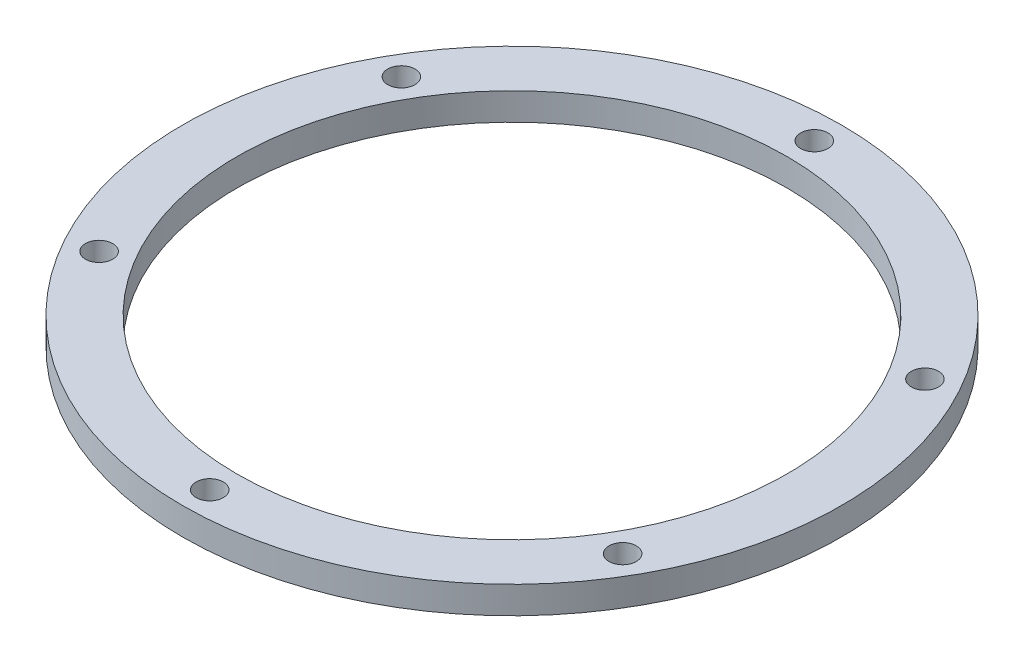
ISO-10303-21;
HEADER;
FILE_DESCRIPTION(('STEP AP214'),'2;1');
FILE_NAME('part.step','',(''),(''),'','','');
FILE_SCHEMA(('AUTOMOTIVE_DESIGN { 1 0 10303 214 1 1 1 1 }'));
ENDSEC;
DATA;
#1=APPLICATION_CONTEXT('core data for automotive mechanical design processes');
#2=APPLICATION_PROTOCOL_DEFINITION('international standard','automotive_design',2000,#1);
#3=PRODUCT_CONTEXT('',#1,'mechanical');
#4=PRODUCT('Part','Part','',(#3));
#5=PRODUCT_RELATED_PRODUCT_CATEGORY('part','',(#4));
#6=PRODUCT_DEFINITION_FORMATION('','',#4);
#7=PRODUCT_DEFINITION_CONTEXT('part definition',#1,'design');
#8=PRODUCT_DEFINITION('design','',#6,#7);
#9=PRODUCT_DEFINITION_SHAPE('','',#8);
#10=(LENGTH_UNIT() NAMED_UNIT(*) SI_UNIT(.MILLI.,.METRE.));
#11=(NAMED_UNIT(*) PLANE_ANGLE_UNIT() SI_UNIT($,.RADIAN.));
#12=(NAMED_UNIT(*) SI_UNIT($,.STERADIAN.) SOLID_ANGLE_UNIT());
#13=UNCERTAINTY_MEASURE_WITH_UNIT(LENGTH_MEASURE(1.E-05),#10,'distance_accuracy_value','');
#14=(GEOMETRIC_REPRESENTATION_CONTEXT(3) GLOBAL_UNCERTAINTY_ASSIGNED_CONTEXT((#13)) GLOBAL_UNIT_ASSIGNED_CONTEXT((#10,
#11,#12)) REPRESENTATION_CONTEXT('',''));
#15=CARTESIAN_POINT('',(0.,0.,0.));
#16=DIRECTION('',(0.,0.,1.));
#17=DIRECTION('',(1.,0.,0.));
#18=AXIS2_PLACEMENT_3D('',#15,#16,#17);
#19=CARTESIAN_POINT('',(0.,3.,0.));
#20=DIRECTION('',(0.,1.,0.));
#21=DIRECTION('',(0.,0.,1.));
#22=AXIS2_PLACEMENT_3D('',#19,#20,#21);
#23=PLANE('',#22);
#24=CARTESIAN_POINT('',(-28.7953446758324,3.,-16.6250000000003));
#25=DIRECTION('',(0.,1.,0.));
#26=DIRECTION('',(0.,0.,1.));
#27=AXIS2_PLACEMENT_3D('',#24,#25,#26);
#28=CIRCLE('',#27,1.5);
#29=CARTESIAN_POINT('',(-28.7953446758324,3.,-15.1250000000003));
#30=VERTEX_POINT('',#29);
#31=EDGE_CURVE('E69',#30,#30,#28,.T.);
#32=ORIENTED_EDGE('',*,*,#31,.F.);
#33=EDGE_LOOP('',(#32));
#34=FACE_BOUND('',#33,.T.);
#35=CARTESIAN_POINT('',(-28.7953446758327,3.,16.6249999999997));
#36=DIRECTION('',(0.,1.,0.));
#37=DIRECTION('',(0.,0.,1.));
#38=AXIS2_PLACEMENT_3D('',#35,#36,#37);
#39=CIRCLE('',#38,1.5);
#40=CARTESIAN_POINT('',(-28.7953446758327,3.,18.1249999999997));
#41=VERTEX_POINT('',#40);
#42=EDGE_CURVE('E73',#41,#41,#39,.T.);
#43=ORIENTED_EDGE('',*,*,#42,.F.);
#44=EDGE_LOOP('',(#43));
#45=FACE_BOUND('',#44,.T.);
#46=CARTESIAN_POINT('',(0.,3.,33.25));
#47=DIRECTION('',(0.,1.,0.));
#48=DIRECTION('',(0.,0.,1.));
#49=AXIS2_PLACEMENT_3D('',#46,#47,#48);
#50=CIRCLE('',#49,1.5);
#51=CARTESIAN_POINT('',(0.,3.,34.75));
#52=VERTEX_POINT('',#51);
#53=EDGE_CURVE('E77',#52,#52,#50,.T.);
#54=ORIENTED_EDGE('',*,*,#53,.F.);
#55=EDGE_LOOP('',(#54));
#56=FACE_BOUND('',#55,.T.);
#57=CARTESIAN_POINT('',(28.7953446758325,3.,16.6250000000001));
#58=DIRECTION('',(0.,1.,0.));
#59=DIRECTION('',(0.,0.,1.));
#60=AXIS2_PLACEMENT_3D('',#57,#58,#59);
#61=CIRCLE('',#60,1.5);
#62=CARTESIAN_POINT('',(28.7953446758325,3.,18.1250000000001));
#63=VERTEX_POINT('',#62);
#64=EDGE_CURVE('E81',#63,#63,#61,.T.);
#65=ORIENTED_EDGE('',*,*,#64,.F.);
#66=EDGE_LOOP('',(#65));
#67=FACE_BOUND('',#66,.T.);
#68=CARTESIAN_POINT('',(28.7953446758326,3.,-16.6249999999999));
#69=DIRECTION('',(0.,1.,0.));
#70=DIRECTION('',(0.,0.,1.));
#71=AXIS2_PLACEMENT_3D('',#68,#69,#70);
#72=CIRCLE('',#71,1.5);
#73=CARTESIAN_POINT('',(28.7953446758326,3.,-15.1249999999999));
#74=VERTEX_POINT('',#73);
#75=EDGE_CURVE('E85',#74,#74,#72,.T.);
#76=ORIENTED_EDGE('',*,*,#75,.F.);
#77=EDGE_LOOP('',(#76));
#78=FACE_BOUND('',#77,.T.);
#79=CARTESIAN_POINT('',(0.,3.,-33.25));
#80=DIRECTION('',(0.,1.,0.));
#81=DIRECTION('',(0.,0.,1.));
#82=AXIS2_PLACEMENT_3D('',#79,#80,#81);
#83=CIRCLE('',#82,1.5);
#84=CARTESIAN_POINT('',(0.,3.,-31.75));
#85=VERTEX_POINT('',#84);
#86=EDGE_CURVE('E58',#85,#85,#83,.T.);
#87=ORIENTED_EDGE('',*,*,#86,.F.);
#88=EDGE_LOOP('',(#87));
#89=FACE_BOUND('',#88,.T.);
#90=CARTESIAN_POINT('',(0.,3.,0.));
#91=DIRECTION('',(0.,1.,0.));
#92=DIRECTION('',(0.,0.,1.));
#93=AXIS2_PLACEMENT_3D('',#90,#91,#92);
#94=CIRCLE('',#93,36.25);
#95=CARTESIAN_POINT('',(0.,3.,36.25));
#96=VERTEX_POINT('',#95);
#97=EDGE_CURVE('E10',#96,#96,#94,.T.);
#98=ORIENTED_EDGE('',*,*,#97,.T.);
#99=EDGE_LOOP('',(#98));
#100=FACE_BOUND('',#99,.T.);
#101=CARTESIAN_POINT('',(0.,3.,0.));
#102=DIRECTION('',(0.,1.,0.));
#103=DIRECTION('',(0.,0.,1.));
#104=AXIS2_PLACEMENT_3D('',#101,#102,#103);
#105=CIRCLE('',#104,30.25);
#106=CARTESIAN_POINT('',(0.,3.,30.25));
#107=VERTEX_POINT('',#106);
#108=EDGE_CURVE('E52',#107,#107,#105,.T.);
#109=ORIENTED_EDGE('',*,*,#108,.F.);
#110=EDGE_LOOP('',(#109));
#111=FACE_BOUND('',#110,.T.);
#112=ADVANCED_FACE('F39',(#34,#45,#56,#67,#78,#89,#100,#111),#23,.T.);
#113=CARTESIAN_POINT('',(0.,0.,0.));
#114=DIRECTION('',(0.,1.,0.));
#115=DIRECTION('',(0.,0.,1.));
#116=AXIS2_PLACEMENT_3D('',#113,#114,#115);
#117=PLANE('',#116);
#118=CARTESIAN_POINT('',(-28.7953446758324,0.,-16.6250000000003));
#119=DIRECTION('',(0.,1.,0.));
#120=DIRECTION('',(0.866025403784433,0.,0.50000000000001));
#121=AXIS2_PLACEMENT_3D('',#118,#119,#120);
#122=CIRCLE('',#121,1.5);
#123=CARTESIAN_POINT('',(-27.4963065701557,0.,-15.8750000000003));
#124=VERTEX_POINT('',#123);
#125=EDGE_CURVE('E94',#124,#124,#122,.T.);
#126=ORIENTED_EDGE('',*,*,#125,.T.);
#127=EDGE_LOOP('',(#126));
#128=FACE_BOUND('',#127,.T.);
#129=CARTESIAN_POINT('',(-28.7953446758327,0.,16.6249999999997));
#130=DIRECTION('',(0.,1.,0.));
#131=DIRECTION('',(0.866025403784443,0.,-0.499999999999992));
#132=AXIS2_PLACEMENT_3D('',#129,#130,#131);
#133=CIRCLE('',#132,1.5);
#134=CARTESIAN_POINT('',(-27.4963065701561,0.,15.8749999999997));
#135=VERTEX_POINT('',#134);
#136=EDGE_CURVE('E98',#135,#135,#133,.T.);
#137=ORIENTED_EDGE('',*,*,#136,.T.);
#138=EDGE_LOOP('',(#137));
#139=FACE_BOUND('',#138,.T.);
#140=CARTESIAN_POINT('',(0.,0.,33.25));
#141=DIRECTION('',(0.,1.,0.));
#142=DIRECTION('',(0.,0.,-1.));
#143=AXIS2_PLACEMENT_3D('',#140,#141,#142);
#144=CIRCLE('',#143,1.5);
#145=CARTESIAN_POINT('',(0.,0.,31.75));
#146=VERTEX_POINT('',#145);
#147=EDGE_CURVE('E102',#146,#146,#144,.T.);
#148=ORIENTED_EDGE('',*,*,#147,.T.);
#149=EDGE_LOOP('',(#148));
#150=FACE_BOUND('',#149,.T.);
#151=CARTESIAN_POINT('',(28.7953446758325,0.,16.6250000000001));
#152=DIRECTION('',(0.,1.,0.));
#153=DIRECTION('',(-0.866025403784436,0.,-0.500000000000004));
#154=AXIS2_PLACEMENT_3D('',#151,#152,#153);
#155=CIRCLE('',#154,1.5);
#156=CARTESIAN_POINT('',(27.4963065701559,0.,15.8750000000001));
#157=VERTEX_POINT('',#156);
#158=EDGE_CURVE('E93',#157,#157,#155,.T.);
#159=ORIENTED_EDGE('',*,*,#158,.T.);
#160=EDGE_LOOP('',(#159));
#161=FACE_BOUND('',#160,.T.);
#162=CARTESIAN_POINT('',(28.7953446758326,0.,-16.6249999999999));
#163=DIRECTION('',(0.,1.,0.));
#164=DIRECTION('',(-0.86602540378444,0.,0.499999999999998));
#165=AXIS2_PLACEMENT_3D('',#162,#163,#164);
#166=CIRCLE('',#165,1.5);
#167=CARTESIAN_POINT('',(27.496306570156,0.,-15.8749999999999));
#168=VERTEX_POINT('',#167);
#169=EDGE_CURVE('E89',#168,#168,#166,.T.);
#170=ORIENTED_EDGE('',*,*,#169,.T.);
#171=EDGE_LOOP('',(#170));
#172=FACE_BOUND('',#171,.T.);
#173=CARTESIAN_POINT('',(0.,0.,-33.25));
#174=DIRECTION('',(0.,1.,0.));
#175=DIRECTION('',(0.,0.,1.));
#176=AXIS2_PLACEMENT_3D('',#173,#174,#175);
#177=CIRCLE('',#176,1.5);
#178=CARTESIAN_POINT('',(0.,0.,-31.75));
#179=VERTEX_POINT('',#178);
#180=EDGE_CURVE('E65',#179,#179,#177,.T.);
#181=ORIENTED_EDGE('',*,*,#180,.T.);
#182=EDGE_LOOP('',(#181));
#183=FACE_BOUND('',#182,.T.);
#184=CARTESIAN_POINT('',(0.,0.,0.));
#185=DIRECTION('',(0.,1.,0.));
#186=DIRECTION('',(0.,0.,1.));
#187=AXIS2_PLACEMENT_3D('',#184,#185,#186);
#188=CIRCLE('',#187,36.25);
#189=CARTESIAN_POINT('',(0.,0.,36.25));
#190=VERTEX_POINT('',#189);
#191=EDGE_CURVE('E43',#190,#190,#188,.T.);
#192=ORIENTED_EDGE('',*,*,#191,.F.);
#193=EDGE_LOOP('',(#192));
#194=FACE_BOUND('',#193,.T.);
#195=CARTESIAN_POINT('',(0.,0.,0.));
#196=DIRECTION('',(0.,1.,0.));
#197=DIRECTION('',(0.,0.,1.));
#198=AXIS2_PLACEMENT_3D('',#195,#196,#197);
#199=CIRCLE('',#198,30.25);
#200=CARTESIAN_POINT('',(0.,0.,30.25));
#201=VERTEX_POINT('',#200);
#202=EDGE_CURVE('E54',#201,#201,#199,.T.);
#203=ORIENTED_EDGE('',*,*,#202,.T.);
#204=EDGE_LOOP('',(#203));
#205=FACE_BOUND('',#204,.T.);
#206=ADVANCED_FACE('F110',(#128,#139,#150,#161,#172,#183,#194,#205),#117,.F.);
#207=CARTESIAN_POINT('',(0.,3.,0.));
#208=DIRECTION('',(0.,-1.,0.));
#209=DIRECTION('',(0.,0.,-1.));
#210=AXIS2_PLACEMENT_3D('',#207,#208,#209);
#211=CYLINDRICAL_SURFACE('',#210,36.25);
#212=ORIENTED_EDGE('',*,*,#97,.F.);
#213=EDGE_LOOP('',(#212));
#214=FACE_BOUND('',#213,.T.);
#215=ORIENTED_EDGE('',*,*,#191,.T.);
#216=EDGE_LOOP('',(#215));
#217=FACE_BOUND('',#216,.T.);
#218=ADVANCED_FACE('F41',(#214,#217),#211,.T.);
#219=CARTESIAN_POINT('',(0.,3.,0.));
#220=DIRECTION('',(0.,-1.,0.));
#221=DIRECTION('',(0.,0.,-1.));
#222=AXIS2_PLACEMENT_3D('',#219,#220,#221);
#223=CYLINDRICAL_SURFACE('',#222,30.25);
#224=ORIENTED_EDGE('',*,*,#108,.T.);
#225=EDGE_LOOP('',(#224));
#226=FACE_BOUND('',#225,.T.);
#227=ORIENTED_EDGE('',*,*,#202,.F.);
#228=EDGE_LOOP('',(#227));
#229=FACE_BOUND('',#228,.T.);
#230=ADVANCED_FACE('F139',(#226,#229),#223,.F.);
#231=CARTESIAN_POINT('',(0.,0.,-33.25));
#232=DIRECTION('',(0.,1.,0.));
#233=DIRECTION('',(0.,0.,1.));
#234=AXIS2_PLACEMENT_3D('',#231,#232,#233);
#235=CYLINDRICAL_SURFACE('',#234,1.5);
#236=ORIENTED_EDGE('',*,*,#86,.T.);
#237=EDGE_LOOP('',(#236));
#238=FACE_BOUND('',#237,.T.);
#239=ORIENTED_EDGE('',*,*,#180,.F.);
#240=EDGE_LOOP('',(#239));
#241=FACE_BOUND('',#240,.T.);
#242=ADVANCED_FACE('F126',(#238,#241),#235,.F.);
#243=CARTESIAN_POINT('',(28.7953446758326,0.,-16.6249999999999));
#244=DIRECTION('',(0.,1.,0.));
#245=DIRECTION('',(0.,0.,1.));
#246=AXIS2_PLACEMENT_3D('',#243,#244,#245);
#247=CYLINDRICAL_SURFACE('',#246,1.5);
#248=ORIENTED_EDGE('',*,*,#75,.T.);
#249=EDGE_LOOP('',(#248));
#250=FACE_BOUND('',#249,.T.);
#251=ORIENTED_EDGE('',*,*,#169,.F.);
#252=EDGE_LOOP('',(#251));
#253=FACE_BOUND('',#252,.T.);
#254=ADVANCED_FACE('F116',(#250,#253),#247,.F.);
#255=CARTESIAN_POINT('',(28.7953446758325,0.,16.6250000000001));
#256=DIRECTION('',(0.,1.,0.));
#257=DIRECTION('',(0.,0.,1.));
#258=AXIS2_PLACEMENT_3D('',#255,#256,#257);
#259=CYLINDRICAL_SURFACE('',#258,1.5);
#260=ORIENTED_EDGE('',*,*,#64,.T.);
#261=EDGE_LOOP('',(#260));
#262=FACE_BOUND('',#261,.T.);
#263=ORIENTED_EDGE('',*,*,#158,.F.);
#264=EDGE_LOOP('',(#263));
#265=FACE_BOUND('',#264,.T.);
#266=ADVANCED_FACE('F113',(#262,#265),#259,.F.);
#267=CARTESIAN_POINT('',(0.,0.,33.25));
#268=DIRECTION('',(0.,1.,0.));
#269=DIRECTION('',(0.,0.,1.));
#270=AXIS2_PLACEMENT_3D('',#267,#268,#269);
#271=CYLINDRICAL_SURFACE('',#270,1.5);
#272=ORIENTED_EDGE('',*,*,#53,.T.);
#273=EDGE_LOOP('',(#272));
#274=FACE_BOUND('',#273,.T.);
#275=ORIENTED_EDGE('',*,*,#147,.F.);
#276=EDGE_LOOP('',(#275));
#277=FACE_BOUND('',#276,.T.);
#278=ADVANCED_FACE('F115',(#274,#277),#271,.F.);
#279=CARTESIAN_POINT('',(-28.7953446758327,0.,16.6249999999997));
#280=DIRECTION('',(0.,1.,0.));
#281=DIRECTION('',(0.,0.,1.));
#282=AXIS2_PLACEMENT_3D('',#279,#280,#281);
#283=CYLINDRICAL_SURFACE('',#282,1.5);
#284=ORIENTED_EDGE('',*,*,#42,.T.);
#285=EDGE_LOOP('',(#284));
#286=FACE_BOUND('',#285,.T.);
#287=ORIENTED_EDGE('',*,*,#136,.F.);
#288=EDGE_LOOP('',(#287));
#289=FACE_BOUND('',#288,.T.);
#290=ADVANCED_FACE('F123',(#286,#289),#283,.F.);
#291=CARTESIAN_POINT('',(-28.7953446758324,0.,-16.6250000000003));
#292=DIRECTION('',(0.,1.,0.));
#293=DIRECTION('',(0.,0.,1.));
#294=AXIS2_PLACEMENT_3D('',#291,#292,#293);
#295=CYLINDRICAL_SURFACE('',#294,1.5);
#296=ORIENTED_EDGE('',*,*,#31,.T.);
#297=EDGE_LOOP('',(#296));
#298=FACE_BOUND('',#297,.T.);
#299=ORIENTED_EDGE('',*,*,#125,.F.);
#300=EDGE_LOOP('',(#299));
#301=FACE_BOUND('',#300,.T.);
#302=ADVANCED_FACE('F146',(#298,#301),#295,.F.);
#303=CLOSED_SHELL('',(#112,#206,#218,#230,#242,#254,#266,#278,#290,#302));
#304=MANIFOLD_SOLID_BREP('B2',#303);
#305=ADVANCED_BREP_SHAPE_REPRESENTATION('',(#18,#304),#14);
#306=SHAPE_DEFINITION_REPRESENTATION(#9,#305);
ENDSEC;
END-ISO-10303-21;
